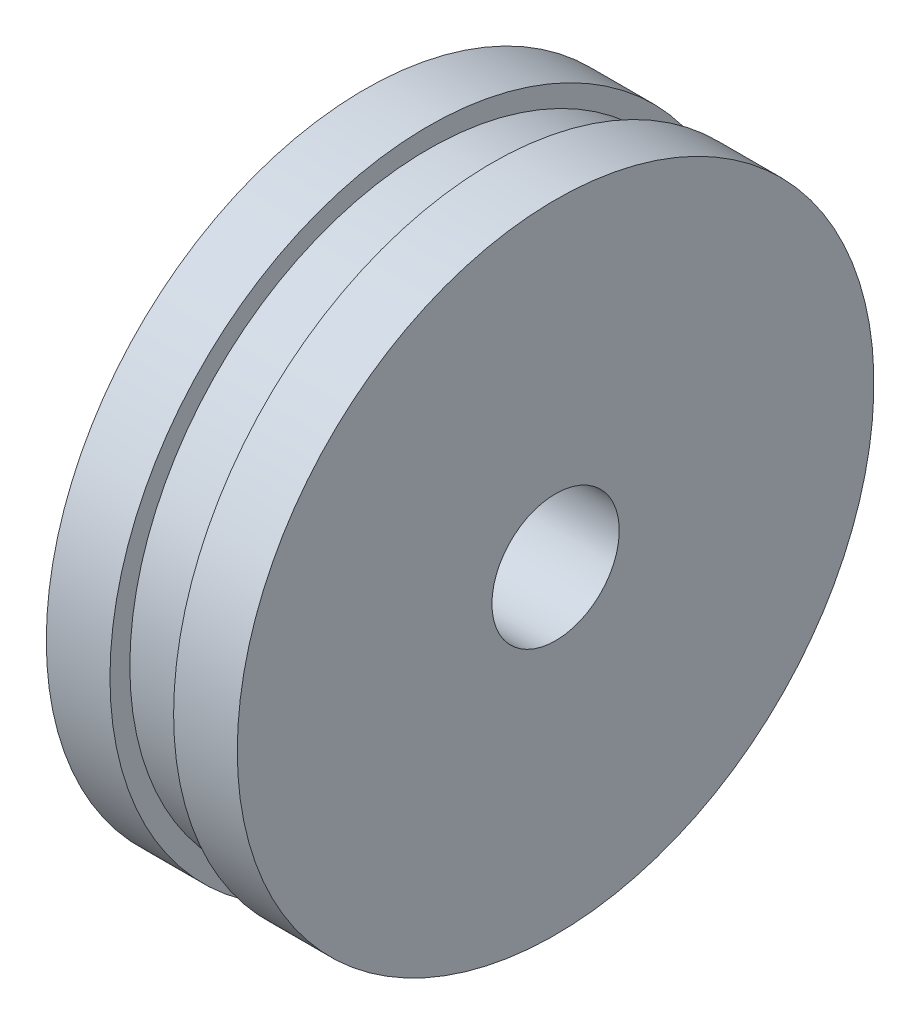
ISO-10303-21;
HEADER;
FILE_DESCRIPTION(('STEP AP214'),'2;1');
FILE_NAME('part.step','',(''),(''),'','','');
FILE_SCHEMA(('AUTOMOTIVE_DESIGN { 1 0 10303 214 1 1 1 1 }'));
ENDSEC;
DATA;
#1=APPLICATION_CONTEXT('core data for automotive mechanical design processes');
#2=APPLICATION_PROTOCOL_DEFINITION('international standard','automotive_design',2000,#1);
#3=PRODUCT_CONTEXT('',#1,'mechanical');
#4=PRODUCT('Part','Part','',(#3));
#5=PRODUCT_RELATED_PRODUCT_CATEGORY('part','',(#4));
#6=PRODUCT_DEFINITION_FORMATION('','',#4);
#7=PRODUCT_DEFINITION_CONTEXT('part definition',#1,'design');
#8=PRODUCT_DEFINITION('design','',#6,#7);
#9=PRODUCT_DEFINITION_SHAPE('','',#8);
#10=(LENGTH_UNIT() NAMED_UNIT(*) SI_UNIT(.MILLI.,.METRE.));
#11=(NAMED_UNIT(*) PLANE_ANGLE_UNIT() SI_UNIT($,.RADIAN.));
#12=(NAMED_UNIT(*) SI_UNIT($,.STERADIAN.) SOLID_ANGLE_UNIT());
#13=UNCERTAINTY_MEASURE_WITH_UNIT(LENGTH_MEASURE(1.E-05),#10,'distance_accuracy_value','');
#14=(GEOMETRIC_REPRESENTATION_CONTEXT(3) GLOBAL_UNCERTAINTY_ASSIGNED_CONTEXT((#13)) GLOBAL_UNIT_ASSIGNED_CONTEXT((#10,
#11,#12)) REPRESENTATION_CONTEXT('',''));
#15=CARTESIAN_POINT('',(0.,0.,0.));
#16=DIRECTION('',(0.,0.,1.));
#17=DIRECTION('',(1.,0.,0.));
#18=AXIS2_PLACEMENT_3D('',#15,#16,#17);
#19=CARTESIAN_POINT('',(-6.,0.,0.));
#20=DIRECTION('',(1.,0.,0.));
#21=DIRECTION('',(0.,0.,-1.));
#22=AXIS2_PLACEMENT_3D('',#19,#20,#21);
#23=PLANE('',#22);
#24=CARTESIAN_POINT('',(-6.,0.,0.));
#25=DIRECTION('',(-1.,0.,0.));
#26=DIRECTION('',(0.,0.,1.));
#27=AXIS2_PLACEMENT_3D('',#24,#25,#26);
#28=CIRCLE('',#27,4.);
#29=CARTESIAN_POINT('',(-6.,0.,4.));
#30=VERTEX_POINT('',#29);
#31=EDGE_CURVE('E67',#30,#30,#28,.T.);
#32=ORIENTED_EDGE('',*,*,#31,.F.);
#33=EDGE_LOOP('',(#32));
#34=FACE_BOUND('',#33,.T.);
#35=CARTESIAN_POINT('',(-6.,0.,0.));
#36=DIRECTION('',(-1.,0.,0.));
#37=DIRECTION('',(0.,0.,1.));
#38=AXIS2_PLACEMENT_3D('',#35,#36,#37);
#39=CIRCLE('',#38,20.);
#40=CARTESIAN_POINT('',(-6.,0.,20.));
#41=VERTEX_POINT('',#40);
#42=EDGE_CURVE('E10',#41,#41,#39,.T.);
#43=ORIENTED_EDGE('',*,*,#42,.T.);
#44=EDGE_LOOP('',(#43));
#45=FACE_BOUND('',#44,.T.);
#46=ADVANCED_FACE('F36',(#34,#45),#23,.F.);
#47=CARTESIAN_POINT('',(-28.81903927696,0.,0.));
#48=DIRECTION('',(-1.,0.,0.));
#49=DIRECTION('',(0.,0.,1.));
#50=AXIS2_PLACEMENT_3D('',#47,#48,#49);
#51=CYLINDRICAL_SURFACE('',#50,20.);
#52=ORIENTED_EDGE('',*,*,#42,.F.);
#53=EDGE_LOOP('',(#52));
#54=FACE_BOUND('',#53,.T.);
#55=CARTESIAN_POINT('',(-2.,0.,0.));
#56=DIRECTION('',(-1.,0.,0.));
#57=DIRECTION('',(0.,0.,1.));
#58=AXIS2_PLACEMENT_3D('',#55,#56,#57);
#59=CIRCLE('',#58,20.);
#60=CARTESIAN_POINT('',(-2.,0.,20.));
#61=VERTEX_POINT('',#60);
#62=EDGE_CURVE('E44',#61,#61,#59,.T.);
#63=ORIENTED_EDGE('',*,*,#62,.T.);
#64=EDGE_LOOP('',(#63));
#65=FACE_BOUND('',#64,.T.);
#66=ADVANCED_FACE('F89',(#54,#65),#51,.T.);
#67=CARTESIAN_POINT('',(-2.,0.,-20.));
#68=DIRECTION('',(-1.,0.,0.));
#69=DIRECTION('',(0.,0.,1.));
#70=AXIS2_PLACEMENT_3D('',#67,#68,#69);
#71=PLANE('',#70);
#72=ORIENTED_EDGE('',*,*,#62,.F.);
#73=EDGE_LOOP('',(#72));
#74=FACE_BOUND('',#73,.T.);
#75=CARTESIAN_POINT('',(-2.,0.,0.));
#76=DIRECTION('',(-1.,0.,0.));
#77=DIRECTION('',(0.,0.,1.));
#78=AXIS2_PLACEMENT_3D('',#75,#76,#77);
#79=CIRCLE('',#78,18.75);
#80=CARTESIAN_POINT('',(-2.,0.,18.75));
#81=VERTEX_POINT('',#80);
#82=EDGE_CURVE('E49',#81,#81,#79,.T.);
#83=ORIENTED_EDGE('',*,*,#82,.T.);
#84=EDGE_LOOP('',(#83));
#85=FACE_BOUND('',#84,.T.);
#86=ADVANCED_FACE('F95',(#74,#85),#71,.F.);
#87=CARTESIAN_POINT('',(-28.81903927696,0.,0.));
#88=DIRECTION('',(-1.,0.,0.));
#89=DIRECTION('',(0.,0.,1.));
#90=AXIS2_PLACEMENT_3D('',#87,#88,#89);
#91=CYLINDRICAL_SURFACE('',#90,18.75);
#92=ORIENTED_EDGE('',*,*,#82,.F.);
#93=EDGE_LOOP('',(#92));
#94=FACE_BOUND('',#93,.T.);
#95=CARTESIAN_POINT('',(2.,0.,0.));
#96=DIRECTION('',(-1.,0.,0.));
#97=DIRECTION('',(0.,0.,1.));
#98=AXIS2_PLACEMENT_3D('',#95,#96,#97);
#99=CIRCLE('',#98,18.75);
#100=CARTESIAN_POINT('',(2.,0.,18.75));
#101=VERTEX_POINT('',#100);
#102=EDGE_CURVE('E55',#101,#101,#99,.T.);
#103=ORIENTED_EDGE('',*,*,#102,.T.);
#104=EDGE_LOOP('',(#103));
#105=FACE_BOUND('',#104,.T.);
#106=ADVANCED_FACE('F100',(#94,#105),#91,.T.);
#107=CARTESIAN_POINT('',(2.,0.,-20.));
#108=DIRECTION('',(1.,0.,0.));
#109=DIRECTION('',(0.,0.,-1.));
#110=AXIS2_PLACEMENT_3D('',#107,#108,#109);
#111=PLANE('',#110);
#112=ORIENTED_EDGE('',*,*,#102,.F.);
#113=EDGE_LOOP('',(#112));
#114=FACE_BOUND('',#113,.T.);
#115=CARTESIAN_POINT('',(2.,0.,0.));
#116=DIRECTION('',(-1.,0.,0.));
#117=DIRECTION('',(0.,0.,1.));
#118=AXIS2_PLACEMENT_3D('',#115,#116,#117);
#119=CIRCLE('',#118,20.);
#120=CARTESIAN_POINT('',(2.,0.,20.));
#121=VERTEX_POINT('',#120);
#122=EDGE_CURVE('E59',#121,#121,#119,.T.);
#123=ORIENTED_EDGE('',*,*,#122,.T.);
#124=EDGE_LOOP('',(#123));
#125=FACE_BOUND('',#124,.T.);
#126=ADVANCED_FACE('F107',(#114,#125),#111,.F.);
#127=CARTESIAN_POINT('',(-28.81903927696,0.,0.));
#128=DIRECTION('',(-1.,0.,0.));
#129=DIRECTION('',(0.,0.,1.));
#130=AXIS2_PLACEMENT_3D('',#127,#128,#129);
#131=CYLINDRICAL_SURFACE('',#130,20.);
#132=ORIENTED_EDGE('',*,*,#122,.F.);
#133=EDGE_LOOP('',(#132));
#134=FACE_BOUND('',#133,.T.);
#135=CARTESIAN_POINT('',(6.,0.,0.));
#136=DIRECTION('',(-1.,0.,0.));
#137=DIRECTION('',(0.,0.,1.));
#138=AXIS2_PLACEMENT_3D('',#135,#136,#137);
#139=CIRCLE('',#138,20.);
#140=CARTESIAN_POINT('',(6.,0.,20.));
#141=VERTEX_POINT('',#140);
#142=EDGE_CURVE('E63',#141,#141,#139,.T.);
#143=ORIENTED_EDGE('',*,*,#142,.T.);
#144=EDGE_LOOP('',(#143));
#145=FACE_BOUND('',#144,.T.);
#146=ADVANCED_FACE('F86',(#134,#145),#131,.T.);
#147=CARTESIAN_POINT('',(6.,0.,0.));
#148=DIRECTION('',(-1.,0.,0.));
#149=DIRECTION('',(0.,0.,1.));
#150=AXIS2_PLACEMENT_3D('',#147,#148,#149);
#151=PLANE('',#150);
#152=CARTESIAN_POINT('',(6.,0.,0.));
#153=DIRECTION('',(-1.,0.,0.));
#154=DIRECTION('',(0.,0.,1.));
#155=AXIS2_PLACEMENT_3D('',#152,#153,#154);
#156=CIRCLE('',#155,4.);
#157=CARTESIAN_POINT('',(6.,0.,4.));
#158=VERTEX_POINT('',#157);
#159=EDGE_CURVE('E39',#158,#158,#156,.T.);
#160=ORIENTED_EDGE('',*,*,#159,.T.);
#161=EDGE_LOOP('',(#160));
#162=FACE_BOUND('',#161,.T.);
#163=ORIENTED_EDGE('',*,*,#142,.F.);
#164=EDGE_LOOP('',(#163));
#165=FACE_BOUND('',#164,.T.);
#166=ADVANCED_FACE('F76',(#162,#165),#151,.F.);
#167=CARTESIAN_POINT('',(34.,0.,0.));
#168=DIRECTION('',(-1.,0.,0.));
#169=DIRECTION('',(0.,0.,1.));
#170=AXIS2_PLACEMENT_3D('',#167,#168,#169);
#171=CYLINDRICAL_SURFACE('',#170,4.);
#172=ORIENTED_EDGE('',*,*,#31,.T.);
#173=EDGE_LOOP('',(#172));
#174=FACE_BOUND('',#173,.T.);
#175=ORIENTED_EDGE('',*,*,#159,.F.);
#176=EDGE_LOOP('',(#175));
#177=FACE_BOUND('',#176,.T.);
#178=ADVANCED_FACE('F79',(#174,#177),#171,.F.);
#179=CLOSED_SHELL('',(#46,#66,#86,#106,#126,#146,#166,#178));
#180=MANIFOLD_SOLID_BREP('B2',#179);
#181=ADVANCED_BREP_SHAPE_REPRESENTATION('',(#18,#180),#14);
#182=SHAPE_DEFINITION_REPRESENTATION(#9,#181);
ENDSEC;
END-ISO-10303-21;
